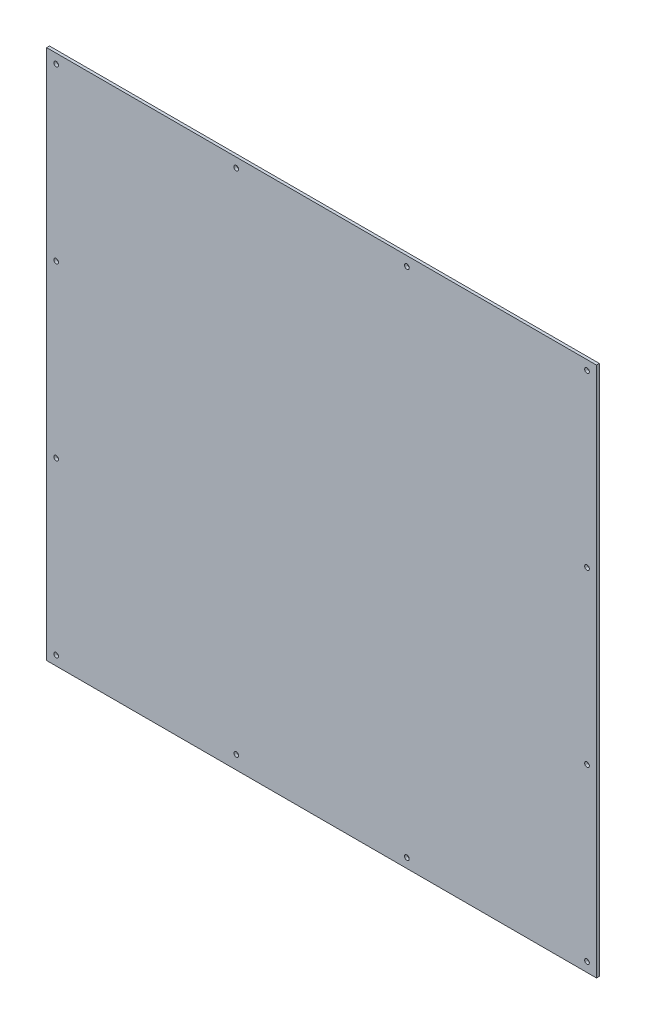
ISO-10303-21;
HEADER;
FILE_DESCRIPTION(('STEP AP214'),'2;1');
FILE_NAME('part.step','',(''),(''),'','','');
FILE_SCHEMA(('AUTOMOTIVE_DESIGN { 1 0 10303 214 1 1 1 1 }'));
ENDSEC;
DATA;
#1=APPLICATION_CONTEXT('core data for automotive mechanical design processes');
#2=APPLICATION_PROTOCOL_DEFINITION('international standard','automotive_design',2000,#1);
#3=PRODUCT_CONTEXT('',#1,'mechanical');
#4=PRODUCT('Part','Part','',(#3));
#5=PRODUCT_RELATED_PRODUCT_CATEGORY('part','',(#4));
#6=PRODUCT_DEFINITION_FORMATION('','',#4);
#7=PRODUCT_DEFINITION_CONTEXT('part definition',#1,'design');
#8=PRODUCT_DEFINITION('design','',#6,#7);
#9=PRODUCT_DEFINITION_SHAPE('','',#8);
#10=(LENGTH_UNIT() NAMED_UNIT(*) SI_UNIT(.MILLI.,.METRE.));
#11=(NAMED_UNIT(*) PLANE_ANGLE_UNIT() SI_UNIT($,.RADIAN.));
#12=(NAMED_UNIT(*) SI_UNIT($,.STERADIAN.) SOLID_ANGLE_UNIT());
#13=UNCERTAINTY_MEASURE_WITH_UNIT(LENGTH_MEASURE(1.E-05),#10,'distance_accuracy_value','');
#14=(GEOMETRIC_REPRESENTATION_CONTEXT(3) GLOBAL_UNCERTAINTY_ASSIGNED_CONTEXT((#13)) GLOBAL_UNIT_ASSIGNED_CONTEXT((#10,
#11,#12)) REPRESENTATION_CONTEXT('',''));
#15=CARTESIAN_POINT('',(0.,0.,0.));
#16=DIRECTION('',(0.,0.,1.));
#17=DIRECTION('',(1.,0.,0.));
#18=AXIS2_PLACEMENT_3D('',#15,#16,#17);
#19=CARTESIAN_POINT('',(-219.558359621451,289.085173501577,3.));
#20=DIRECTION('',(1.,0.,0.));
#21=DIRECTION('',(0.,1.,0.));
#22=AXIS2_PLACEMENT_3D('',#19,#20,#21);
#23=PLANE('',#22);
#24=DIRECTION('',(0.,-1.,0.));
#25=VECTOR('',#24,1.);
#26=CARTESIAN_POINT('',(-219.558359621451,289.085173501577,0.));
#27=LINE('',#26,#25);
#28=CARTESIAN_POINT('',(-219.558359621451,289.085173501577,0.));
#29=VERTEX_POINT('',#28);
#30=CARTESIAN_POINT('',(-219.558359621451,-270.914826498423,0.));
#31=VERTEX_POINT('',#30);
#32=EDGE_CURVE('E96',#29,#31,#27,.T.);
#33=ORIENTED_EDGE('',*,*,#32,.T.);
#34=DIRECTION('',(0.,0.,-1.));
#35=VECTOR('',#34,1.);
#36=CARTESIAN_POINT('',(-219.558359621451,-270.914826498423,3.));
#37=LINE('',#36,#35);
#38=CARTESIAN_POINT('',(-219.558359621451,-270.914826498423,3.));
#39=VERTEX_POINT('',#38);
#40=EDGE_CURVE('E11',#39,#31,#37,.T.);
#41=ORIENTED_EDGE('',*,*,#40,.F.);
#42=DIRECTION('',(0.,-1.,0.));
#43=VECTOR('',#42,1.);
#44=CARTESIAN_POINT('',(-219.558359621451,289.085173501577,3.));
#45=LINE('',#44,#43);
#46=CARTESIAN_POINT('',(-219.558359621451,289.085173501577,3.));
#47=VERTEX_POINT('',#46);
#48=EDGE_CURVE('E84',#47,#39,#45,.T.);
#49=ORIENTED_EDGE('',*,*,#48,.F.);
#50=DIRECTION('',(0.,0.,-1.));
#51=VECTOR('',#50,1.);
#52=CARTESIAN_POINT('',(-219.558359621451,289.085173501577,3.));
#53=LINE('',#52,#51);
#54=EDGE_CURVE('E92',#47,#29,#53,.T.);
#55=ORIENTED_EDGE('',*,*,#54,.T.);
#56=EDGE_LOOP('',(#33,#41,#49,#55));
#57=FACE_BOUND('',#56,.T.);
#58=ADVANCED_FACE('F33',(#57),#23,.F.);
#59=CARTESIAN_POINT('',(-219.558359621451,-270.914826498423,3.));
#60=DIRECTION('',(0.,1.,0.));
#61=DIRECTION('',(0.,0.,1.));
#62=AXIS2_PLACEMENT_3D('',#59,#60,#61);
#63=PLANE('',#62);
#64=DIRECTION('',(1.,0.,0.));
#65=VECTOR('',#64,1.);
#66=CARTESIAN_POINT('',(-219.558359621451,-270.914826498423,0.));
#67=LINE('',#66,#65);
#68=CARTESIAN_POINT('',(360.441640378549,-270.914826498423,0.));
#69=VERTEX_POINT('',#68);
#70=EDGE_CURVE('E88',#31,#69,#67,.T.);
#71=ORIENTED_EDGE('',*,*,#70,.T.);
#72=DIRECTION('',(0.,0.,-1.));
#73=VECTOR('',#72,1.);
#74=CARTESIAN_POINT('',(360.441640378549,-270.914826498423,3.));
#75=LINE('',#74,#73);
#76=CARTESIAN_POINT('',(360.441640378549,-270.914826498423,3.));
#77=VERTEX_POINT('',#76);
#78=EDGE_CURVE('E41',#77,#69,#75,.T.);
#79=ORIENTED_EDGE('',*,*,#78,.F.);
#80=DIRECTION('',(1.,0.,0.));
#81=VECTOR('',#80,1.);
#82=CARTESIAN_POINT('',(-219.558359621451,-270.914826498423,3.));
#83=LINE('',#82,#81);
#84=EDGE_CURVE('E79',#39,#77,#83,.T.);
#85=ORIENTED_EDGE('',*,*,#84,.F.);
#86=ORIENTED_EDGE('',*,*,#40,.T.);
#87=EDGE_LOOP('',(#71,#79,#85,#86));
#88=FACE_BOUND('',#87,.T.);
#89=ADVANCED_FACE('F87',(#88),#63,.F.);
#90=CARTESIAN_POINT('',(360.441640378549,289.085173501577,3.));
#91=DIRECTION('',(-1.,0.,0.));
#92=DIRECTION('',(0.,-1.,0.));
#93=AXIS2_PLACEMENT_3D('',#90,#91,#92);
#94=PLANE('',#93);
#95=DIRECTION('',(0.,1.,0.));
#96=VECTOR('',#95,1.);
#97=CARTESIAN_POINT('',(360.441640378549,289.085173501577,0.));
#98=LINE('',#97,#96);
#99=CARTESIAN_POINT('',(360.441640378549,289.085173501577,0.));
#100=VERTEX_POINT('',#99);
#101=EDGE_CURVE('E66',#69,#100,#98,.T.);
#102=ORIENTED_EDGE('',*,*,#101,.T.);
#103=DIRECTION('',(0.,0.,-1.));
#104=VECTOR('',#103,1.);
#105=CARTESIAN_POINT('',(360.441640378549,289.085173501577,3.));
#106=LINE('',#105,#104);
#107=CARTESIAN_POINT('',(360.441640378549,289.085173501577,3.));
#108=VERTEX_POINT('',#107);
#109=EDGE_CURVE('E89',#108,#100,#106,.T.);
#110=ORIENTED_EDGE('',*,*,#109,.F.);
#111=DIRECTION('',(0.,1.,0.));
#112=VECTOR('',#111,1.);
#113=CARTESIAN_POINT('',(360.441640378549,289.085173501577,3.));
#114=LINE('',#113,#112);
#115=EDGE_CURVE('E82',#77,#108,#114,.T.);
#116=ORIENTED_EDGE('',*,*,#115,.F.);
#117=ORIENTED_EDGE('',*,*,#78,.T.);
#118=EDGE_LOOP('',(#102,#110,#116,#117));
#119=FACE_BOUND('',#118,.T.);
#120=ADVANCED_FACE('F90',(#119),#94,.F.);
#121=CARTESIAN_POINT('',(-219.558359621451,289.085173501577,3.));
#122=DIRECTION('',(0.,-1.,0.));
#123=DIRECTION('',(0.,0.,-1.));
#124=AXIS2_PLACEMENT_3D('',#121,#122,#123);
#125=PLANE('',#124);
#126=DIRECTION('',(-1.,0.,0.));
#127=VECTOR('',#126,1.);
#128=CARTESIAN_POINT('',(-219.558359621451,289.085173501577,0.));
#129=LINE('',#128,#127);
#130=EDGE_CURVE('E72',#100,#29,#129,.T.);
#131=ORIENTED_EDGE('',*,*,#130,.T.);
#132=ORIENTED_EDGE('',*,*,#54,.F.);
#133=DIRECTION('',(-1.,0.,0.));
#134=VECTOR('',#133,1.);
#135=CARTESIAN_POINT('',(-219.558359621451,289.085173501577,3.));
#136=LINE('',#135,#134);
#137=EDGE_CURVE('E49',#108,#47,#136,.T.);
#138=ORIENTED_EDGE('',*,*,#137,.F.);
#139=ORIENTED_EDGE('',*,*,#109,.T.);
#140=EDGE_LOOP('',(#131,#132,#138,#139));
#141=FACE_BOUND('',#140,.T.);
#142=ADVANCED_FACE('F104',(#141),#125,.F.);
#143=CARTESIAN_POINT('',(0.,0.,3.));
#144=DIRECTION('',(0.,0.,1.));
#145=DIRECTION('',(1.,0.,0.));
#146=AXIS2_PLACEMENT_3D('',#143,#144,#145);
#147=PLANE('',#146);
#148=CARTESIAN_POINT('',(-19.558359621451,-256.625367838756,3.));
#149=DIRECTION('',(0.,0.,1.));
#150=DIRECTION('',(1.,0.,0.));
#151=AXIS2_PLACEMENT_3D('',#148,#149,#150);
#152=CIRCLE('',#151,2.5);
#153=CARTESIAN_POINT('',(-17.058359621451,-256.625367838756,3.));
#154=VERTEX_POINT('',#153);
#155=EDGE_CURVE('E140',#154,#154,#152,.T.);
#156=ORIENTED_EDGE('',*,*,#155,.F.);
#157=EDGE_LOOP('',(#156));
#158=FACE_BOUND('',#157,.T.);
#159=CARTESIAN_POINT('',(350.441640378549,-260.914826498423,3.));
#160=DIRECTION('',(0.,0.,1.));
#161=DIRECTION('',(1.,0.,0.));
#162=AXIS2_PLACEMENT_3D('',#159,#160,#161);
#163=CIRCLE('',#162,2.49999999999997);
#164=CARTESIAN_POINT('',(352.941640378549,-260.914826498423,3.));
#165=VERTEX_POINT('',#164);
#166=EDGE_CURVE('E147',#165,#165,#163,.T.);
#167=ORIENTED_EDGE('',*,*,#166,.F.);
#168=EDGE_LOOP('',(#167));
#169=FACE_BOUND('',#168,.T.);
#170=CARTESIAN_POINT('',(350.441640378549,-80.9148264984229,3.));
#171=DIRECTION('',(0.,0.,1.));
#172=DIRECTION('',(1.,0.,0.));
#173=AXIS2_PLACEMENT_3D('',#170,#171,#172);
#174=CIRCLE('',#173,2.49999999999997);
#175=CARTESIAN_POINT('',(352.941640378549,-80.9148264984229,3.));
#176=VERTEX_POINT('',#175);
#177=EDGE_CURVE('E153',#176,#176,#174,.T.);
#178=ORIENTED_EDGE('',*,*,#177,.F.);
#179=EDGE_LOOP('',(#178));
#180=FACE_BOUND('',#179,.T.);
#181=CARTESIAN_POINT('',(350.441640378549,99.0851735015771,3.));
#182=DIRECTION('',(0.,0.,1.));
#183=DIRECTION('',(1.,0.,0.));
#184=AXIS2_PLACEMENT_3D('',#181,#182,#183);
#185=CIRCLE('',#184,2.49999999999997);
#186=CARTESIAN_POINT('',(352.941640378549,99.0851735015771,3.));
#187=VERTEX_POINT('',#186);
#188=EDGE_CURVE('E159',#187,#187,#185,.T.);
#189=ORIENTED_EDGE('',*,*,#188,.F.);
#190=EDGE_LOOP('',(#189));
#191=FACE_BOUND('',#190,.T.);
#192=CARTESIAN_POINT('',(-209.558359621451,99.0851735015771,3.));
#193=DIRECTION('',(0.,0.,1.));
#194=DIRECTION('',(1.,0.,0.));
#195=AXIS2_PLACEMENT_3D('',#192,#193,#194);
#196=CIRCLE('',#195,2.5);
#197=CARTESIAN_POINT('',(-207.058359621451,99.0851735015771,3.));
#198=VERTEX_POINT('',#197);
#199=EDGE_CURVE('E123',#198,#198,#196,.T.);
#200=ORIENTED_EDGE('',*,*,#199,.F.);
#201=EDGE_LOOP('',(#200));
#202=FACE_BOUND('',#201,.T.);
#203=CARTESIAN_POINT('',(-209.558359621451,-260.914826498423,3.));
#204=DIRECTION('',(0.,0.,1.));
#205=DIRECTION('',(1.,0.,0.));
#206=AXIS2_PLACEMENT_3D('',#203,#204,#205);
#207=CIRCLE('',#206,2.5);
#208=CARTESIAN_POINT('',(-207.058359621451,-260.914826498423,3.));
#209=VERTEX_POINT('',#208);
#210=EDGE_CURVE('E116',#209,#209,#207,.T.);
#211=ORIENTED_EDGE('',*,*,#210,.F.);
#212=EDGE_LOOP('',(#211));
#213=FACE_BOUND('',#212,.T.);
#214=CARTESIAN_POINT('',(-209.558359621451,-80.9148264984229,3.));
#215=DIRECTION('',(0.,0.,1.));
#216=DIRECTION('',(1.,0.,0.));
#217=AXIS2_PLACEMENT_3D('',#214,#215,#216);
#218=CIRCLE('',#217,2.5);
#219=CARTESIAN_POINT('',(-207.058359621451,-80.9148264984229,3.));
#220=VERTEX_POINT('',#219);
#221=EDGE_CURVE('E135',#220,#220,#218,.T.);
#222=ORIENTED_EDGE('',*,*,#221,.F.);
#223=EDGE_LOOP('',(#222));
#224=FACE_BOUND('',#223,.T.);
#225=CARTESIAN_POINT('',(350.441640378549,279.085173501577,3.));
#226=DIRECTION('',(0.,0.,1.));
#227=DIRECTION('',(1.,0.,0.));
#228=AXIS2_PLACEMENT_3D('',#225,#226,#227);
#229=CIRCLE('',#228,2.49999999999997);
#230=CARTESIAN_POINT('',(352.941640378549,279.085173501577,3.));
#231=VERTEX_POINT('',#230);
#232=EDGE_CURVE('E128',#231,#231,#229,.T.);
#233=ORIENTED_EDGE('',*,*,#232,.F.);
#234=EDGE_LOOP('',(#233));
#235=FACE_BOUND('',#234,.T.);
#236=CARTESIAN_POINT('',(160.441640378549,279.085173501577,3.));
#237=DIRECTION('',(0.,0.,1.));
#238=DIRECTION('',(1.,0.,0.));
#239=AXIS2_PLACEMENT_3D('',#236,#237,#238);
#240=CIRCLE('',#239,2.5);
#241=CARTESIAN_POINT('',(162.941640378549,279.085173501577,3.));
#242=VERTEX_POINT('',#241);
#243=EDGE_CURVE('E176',#242,#242,#240,.T.);
#244=ORIENTED_EDGE('',*,*,#243,.F.);
#245=EDGE_LOOP('',(#244));
#246=FACE_BOUND('',#245,.T.);
#247=CARTESIAN_POINT('',(-19.558359621451,279.085173501577,3.));
#248=DIRECTION('',(0.,0.,1.));
#249=DIRECTION('',(1.,0.,0.));
#250=AXIS2_PLACEMENT_3D('',#247,#248,#249);
#251=CIRCLE('',#250,2.5);
#252=CARTESIAN_POINT('',(-17.058359621451,279.085173501577,3.));
#253=VERTEX_POINT('',#252);
#254=EDGE_CURVE('E164',#253,#253,#251,.T.);
#255=ORIENTED_EDGE('',*,*,#254,.F.);
#256=EDGE_LOOP('',(#255));
#257=FACE_BOUND('',#256,.T.);
#258=CARTESIAN_POINT('',(160.441640378549,-260.914826498423,3.));
#259=DIRECTION('',(0.,0.,1.));
#260=DIRECTION('',(1.,0.,0.));
#261=AXIS2_PLACEMENT_3D('',#258,#259,#260);
#262=CIRCLE('',#261,2.5);
#263=CARTESIAN_POINT('',(162.941640378549,-260.914826498423,3.));
#264=VERTEX_POINT('',#263);
#265=EDGE_CURVE('E171',#264,#264,#262,.T.);
#266=ORIENTED_EDGE('',*,*,#265,.F.);
#267=EDGE_LOOP('',(#266));
#268=FACE_BOUND('',#267,.T.);
#269=CARTESIAN_POINT('',(-209.558359621451,279.085173501577,3.));
#270=DIRECTION('',(0.,0.,1.));
#271=DIRECTION('',(1.,0.,0.));
#272=AXIS2_PLACEMENT_3D('',#269,#270,#271);
#273=CIRCLE('',#272,2.5);
#274=CARTESIAN_POINT('',(-207.058359621451,279.085173501577,3.));
#275=VERTEX_POINT('',#274);
#276=EDGE_CURVE('E110',#275,#275,#273,.T.);
#277=ORIENTED_EDGE('',*,*,#276,.F.);
#278=EDGE_LOOP('',(#277));
#279=FACE_BOUND('',#278,.T.);
#280=ORIENTED_EDGE('',*,*,#48,.T.);
#281=ORIENTED_EDGE('',*,*,#84,.T.);
#282=ORIENTED_EDGE('',*,*,#115,.T.);
#283=ORIENTED_EDGE('',*,*,#137,.T.);
#284=EDGE_LOOP('',(#280,#281,#282,#283));
#285=FACE_BOUND('',#284,.T.);
#286=ADVANCED_FACE('F80',(#158,#169,#180,#191,#202,#213,#224,#235,#246,#257,#268,#279,#285),
#147,.T.);
#287=CARTESIAN_POINT('',(0.,0.,0.));
#288=DIRECTION('',(0.,0.,1.));
#289=DIRECTION('',(1.,0.,0.));
#290=AXIS2_PLACEMENT_3D('',#287,#288,#289);
#291=PLANE('',#290);
#292=CARTESIAN_POINT('',(-19.558359621451,-256.625367838756,0.));
#293=DIRECTION('',(0.,0.,1.));
#294=DIRECTION('',(1.,0.,0.));
#295=AXIS2_PLACEMENT_3D('',#292,#293,#294);
#296=CIRCLE('',#295,2.5);
#297=CARTESIAN_POINT('',(-17.058359621451,-256.625367838756,0.));
#298=VERTEX_POINT('',#297);
#299=EDGE_CURVE('E143',#298,#298,#296,.T.);
#300=ORIENTED_EDGE('',*,*,#299,.T.);
#301=EDGE_LOOP('',(#300));
#302=FACE_BOUND('',#301,.T.);
#303=CARTESIAN_POINT('',(350.441640378549,-260.914826498423,0.));
#304=DIRECTION('',(0.,0.,1.));
#305=DIRECTION('',(1.,0.,0.));
#306=AXIS2_PLACEMENT_3D('',#303,#304,#305);
#307=CIRCLE('',#306,2.49999999999997);
#308=CARTESIAN_POINT('',(352.941640378549,-260.914826498423,0.));
#309=VERTEX_POINT('',#308);
#310=EDGE_CURVE('E150',#309,#309,#307,.T.);
#311=ORIENTED_EDGE('',*,*,#310,.T.);
#312=EDGE_LOOP('',(#311));
#313=FACE_BOUND('',#312,.T.);
#314=CARTESIAN_POINT('',(350.441640378549,-80.9148264984229,0.));
#315=DIRECTION('',(0.,0.,1.));
#316=DIRECTION('',(1.,0.,0.));
#317=AXIS2_PLACEMENT_3D('',#314,#315,#316);
#318=CIRCLE('',#317,2.49999999999997);
#319=CARTESIAN_POINT('',(352.941640378549,-80.9148264984229,0.));
#320=VERTEX_POINT('',#319);
#321=EDGE_CURVE('E156',#320,#320,#318,.T.);
#322=ORIENTED_EDGE('',*,*,#321,.T.);
#323=EDGE_LOOP('',(#322));
#324=FACE_BOUND('',#323,.T.);
#325=CARTESIAN_POINT('',(350.441640378549,99.0851735015771,0.));
#326=DIRECTION('',(0.,0.,1.));
#327=DIRECTION('',(1.,0.,0.));
#328=AXIS2_PLACEMENT_3D('',#325,#326,#327);
#329=CIRCLE('',#328,2.49999999999997);
#330=CARTESIAN_POINT('',(352.941640378549,99.0851735015771,0.));
#331=VERTEX_POINT('',#330);
#332=EDGE_CURVE('E132',#331,#331,#329,.T.);
#333=ORIENTED_EDGE('',*,*,#332,.T.);
#334=EDGE_LOOP('',(#333));
#335=FACE_BOUND('',#334,.T.);
#336=CARTESIAN_POINT('',(-209.558359621451,99.0851735015771,0.));
#337=DIRECTION('',(0.,0.,1.));
#338=DIRECTION('',(1.,0.,0.));
#339=AXIS2_PLACEMENT_3D('',#336,#337,#338);
#340=CIRCLE('',#339,2.5);
#341=CARTESIAN_POINT('',(-207.058359621451,99.0851735015771,0.));
#342=VERTEX_POINT('',#341);
#343=EDGE_CURVE('E113',#342,#342,#340,.T.);
#344=ORIENTED_EDGE('',*,*,#343,.T.);
#345=EDGE_LOOP('',(#344));
#346=FACE_BOUND('',#345,.T.);
#347=CARTESIAN_POINT('',(-209.558359621451,-260.914826498423,0.));
#348=DIRECTION('',(0.,0.,1.));
#349=DIRECTION('',(1.,0.,0.));
#350=AXIS2_PLACEMENT_3D('',#347,#348,#349);
#351=CIRCLE('',#350,2.5);
#352=CARTESIAN_POINT('',(-207.058359621451,-260.914826498423,0.));
#353=VERTEX_POINT('',#352);
#354=EDGE_CURVE('E119',#353,#353,#351,.T.);
#355=ORIENTED_EDGE('',*,*,#354,.T.);
#356=EDGE_LOOP('',(#355));
#357=FACE_BOUND('',#356,.T.);
#358=CARTESIAN_POINT('',(-209.558359621451,-80.9148264984229,0.));
#359=DIRECTION('',(0.,0.,1.));
#360=DIRECTION('',(1.,0.,0.));
#361=AXIS2_PLACEMENT_3D('',#358,#359,#360);
#362=CIRCLE('',#361,2.5);
#363=CARTESIAN_POINT('',(-207.058359621451,-80.9148264984229,0.));
#364=VERTEX_POINT('',#363);
#365=EDGE_CURVE('E120',#364,#364,#362,.T.);
#366=ORIENTED_EDGE('',*,*,#365,.T.);
#367=EDGE_LOOP('',(#366));
#368=FACE_BOUND('',#367,.T.);
#369=CARTESIAN_POINT('',(350.441640378549,279.085173501577,0.));
#370=DIRECTION('',(0.,0.,1.));
#371=DIRECTION('',(1.,0.,0.));
#372=AXIS2_PLACEMENT_3D('',#369,#370,#371);
#373=CIRCLE('',#372,2.49999999999997);
#374=CARTESIAN_POINT('',(352.941640378549,279.085173501577,0.));
#375=VERTEX_POINT('',#374);
#376=EDGE_CURVE('E131',#375,#375,#373,.T.);
#377=ORIENTED_EDGE('',*,*,#376,.T.);
#378=EDGE_LOOP('',(#377));
#379=FACE_BOUND('',#378,.T.);
#380=CARTESIAN_POINT('',(160.441640378549,279.085173501577,0.));
#381=DIRECTION('',(0.,0.,1.));
#382=DIRECTION('',(1.,0.,0.));
#383=AXIS2_PLACEMENT_3D('',#380,#381,#382);
#384=CIRCLE('',#383,2.5);
#385=CARTESIAN_POINT('',(162.941640378549,279.085173501577,0.));
#386=VERTEX_POINT('',#385);
#387=EDGE_CURVE('E168',#386,#386,#384,.T.);
#388=ORIENTED_EDGE('',*,*,#387,.T.);
#389=EDGE_LOOP('',(#388));
#390=FACE_BOUND('',#389,.T.);
#391=CARTESIAN_POINT('',(-19.558359621451,279.085173501577,0.));
#392=DIRECTION('',(0.,0.,1.));
#393=DIRECTION('',(1.,0.,0.));
#394=AXIS2_PLACEMENT_3D('',#391,#392,#393);
#395=CIRCLE('',#394,2.5);
#396=CARTESIAN_POINT('',(-17.058359621451,279.085173501577,0.));
#397=VERTEX_POINT('',#396);
#398=EDGE_CURVE('E167',#397,#397,#395,.T.);
#399=ORIENTED_EDGE('',*,*,#398,.T.);
#400=EDGE_LOOP('',(#399));
#401=FACE_BOUND('',#400,.T.);
#402=CARTESIAN_POINT('',(160.441640378549,-260.914826498423,0.));
#403=DIRECTION('',(0.,0.,1.));
#404=DIRECTION('',(1.,0.,0.));
#405=AXIS2_PLACEMENT_3D('',#402,#403,#404);
#406=CIRCLE('',#405,2.5);
#407=CARTESIAN_POINT('',(162.941640378549,-260.914826498423,0.));
#408=VERTEX_POINT('',#407);
#409=EDGE_CURVE('E144',#408,#408,#406,.T.);
#410=ORIENTED_EDGE('',*,*,#409,.T.);
#411=EDGE_LOOP('',(#410));
#412=FACE_BOUND('',#411,.T.);
#413=CARTESIAN_POINT('',(-209.558359621451,279.085173501577,0.));
#414=DIRECTION('',(0.,0.,1.));
#415=DIRECTION('',(1.,0.,0.));
#416=AXIS2_PLACEMENT_3D('',#413,#414,#415);
#417=CIRCLE('',#416,2.5);
#418=CARTESIAN_POINT('',(-207.058359621451,279.085173501577,0.));
#419=VERTEX_POINT('',#418);
#420=EDGE_CURVE('E99',#419,#419,#417,.T.);
#421=ORIENTED_EDGE('',*,*,#420,.T.);
#422=EDGE_LOOP('',(#421));
#423=FACE_BOUND('',#422,.T.);
#424=ORIENTED_EDGE('',*,*,#32,.F.);
#425=ORIENTED_EDGE('',*,*,#130,.F.);
#426=ORIENTED_EDGE('',*,*,#101,.F.);
#427=ORIENTED_EDGE('',*,*,#70,.F.);
#428=EDGE_LOOP('',(#424,#425,#426,#427));
#429=FACE_BOUND('',#428,.T.);
#430=ADVANCED_FACE('F107',(#302,#313,#324,#335,#346,#357,#368,#379,#390,#401,#412,#423,#429),
#291,.F.);
#431=CARTESIAN_POINT('',(-209.558359621451,279.085173501577,0.));
#432=DIRECTION('',(0.,0.,1.));
#433=DIRECTION('',(1.,0.,0.));
#434=AXIS2_PLACEMENT_3D('',#431,#432,#433);
#435=CYLINDRICAL_SURFACE('',#434,2.5);
#436=ORIENTED_EDGE('',*,*,#420,.F.);
#437=EDGE_LOOP('',(#436));
#438=FACE_BOUND('',#437,.T.);
#439=ORIENTED_EDGE('',*,*,#276,.T.);
#440=EDGE_LOOP('',(#439));
#441=FACE_BOUND('',#440,.T.);
#442=ADVANCED_FACE('F202',(#438,#441),#435,.F.);
#443=CARTESIAN_POINT('',(160.441640378549,-260.914826498423,0.));
#444=DIRECTION('',(0.,0.,1.));
#445=DIRECTION('',(1.,0.,0.));
#446=AXIS2_PLACEMENT_3D('',#443,#444,#445);
#447=CYLINDRICAL_SURFACE('',#446,2.5);
#448=ORIENTED_EDGE('',*,*,#409,.F.);
#449=EDGE_LOOP('',(#448));
#450=FACE_BOUND('',#449,.T.);
#451=ORIENTED_EDGE('',*,*,#265,.T.);
#452=EDGE_LOOP('',(#451));
#453=FACE_BOUND('',#452,.T.);
#454=ADVANCED_FACE('F204',(#450,#453),#447,.F.);
#455=CARTESIAN_POINT('',(-19.558359621451,279.085173501577,0.));
#456=DIRECTION('',(0.,0.,1.));
#457=DIRECTION('',(1.,0.,0.));
#458=AXIS2_PLACEMENT_3D('',#455,#456,#457);
#459=CYLINDRICAL_SURFACE('',#458,2.5);
#460=ORIENTED_EDGE('',*,*,#398,.F.);
#461=EDGE_LOOP('',(#460));
#462=FACE_BOUND('',#461,.T.);
#463=ORIENTED_EDGE('',*,*,#254,.T.);
#464=EDGE_LOOP('',(#463));
#465=FACE_BOUND('',#464,.T.);
#466=ADVANCED_FACE('F188',(#462,#465),#459,.F.);
#467=CARTESIAN_POINT('',(160.441640378549,279.085173501577,0.));
#468=DIRECTION('',(0.,0.,1.));
#469=DIRECTION('',(1.,0.,0.));
#470=AXIS2_PLACEMENT_3D('',#467,#468,#469);
#471=CYLINDRICAL_SURFACE('',#470,2.5);
#472=ORIENTED_EDGE('',*,*,#387,.F.);
#473=EDGE_LOOP('',(#472));
#474=FACE_BOUND('',#473,.T.);
#475=ORIENTED_EDGE('',*,*,#243,.T.);
#476=EDGE_LOOP('',(#475));
#477=FACE_BOUND('',#476,.T.);
#478=ADVANCED_FACE('F184',(#474,#477),#471,.F.);
#479=CARTESIAN_POINT('',(350.441640378549,279.085173501577,0.));
#480=DIRECTION('',(0.,0.,1.));
#481=DIRECTION('',(1.,0.,0.));
#482=AXIS2_PLACEMENT_3D('',#479,#480,#481);
#483=CYLINDRICAL_SURFACE('',#482,2.49999999999997);
#484=ORIENTED_EDGE('',*,*,#376,.F.);
#485=EDGE_LOOP('',(#484));
#486=FACE_BOUND('',#485,.T.);
#487=ORIENTED_EDGE('',*,*,#232,.T.);
#488=EDGE_LOOP('',(#487));
#489=FACE_BOUND('',#488,.T.);
#490=ADVANCED_FACE('F187',(#486,#489),#483,.F.);
#491=CARTESIAN_POINT('',(-209.558359621451,-80.9148264984229,0.));
#492=DIRECTION('',(0.,0.,1.));
#493=DIRECTION('',(1.,0.,0.));
#494=AXIS2_PLACEMENT_3D('',#491,#492,#493);
#495=CYLINDRICAL_SURFACE('',#494,2.5);
#496=ORIENTED_EDGE('',*,*,#365,.F.);
#497=EDGE_LOOP('',(#496));
#498=FACE_BOUND('',#497,.T.);
#499=ORIENTED_EDGE('',*,*,#221,.T.);
#500=EDGE_LOOP('',(#499));
#501=FACE_BOUND('',#500,.T.);
#502=ADVANCED_FACE('F273',(#498,#501),#495,.F.);
#503=CARTESIAN_POINT('',(-209.558359621451,-260.914826498423,0.));
#504=DIRECTION('',(0.,0.,1.));
#505=DIRECTION('',(1.,0.,0.));
#506=AXIS2_PLACEMENT_3D('',#503,#504,#505);
#507=CYLINDRICAL_SURFACE('',#506,2.5);
#508=ORIENTED_EDGE('',*,*,#354,.F.);
#509=EDGE_LOOP('',(#508));
#510=FACE_BOUND('',#509,.T.);
#511=ORIENTED_EDGE('',*,*,#210,.T.);
#512=EDGE_LOOP('',(#511));
#513=FACE_BOUND('',#512,.T.);
#514=ADVANCED_FACE('F283',(#510,#513),#507,.F.);
#515=CARTESIAN_POINT('',(-209.558359621451,99.0851735015771,0.));
#516=DIRECTION('',(0.,0.,1.));
#517=DIRECTION('',(1.,0.,0.));
#518=AXIS2_PLACEMENT_3D('',#515,#516,#517);
#519=CYLINDRICAL_SURFACE('',#518,2.5);
#520=ORIENTED_EDGE('',*,*,#343,.F.);
#521=EDGE_LOOP('',(#520));
#522=FACE_BOUND('',#521,.T.);
#523=ORIENTED_EDGE('',*,*,#199,.T.);
#524=EDGE_LOOP('',(#523));
#525=FACE_BOUND('',#524,.T.);
#526=ADVANCED_FACE('F293',(#522,#525),#519,.F.);
#527=CARTESIAN_POINT('',(350.441640378549,99.0851735015771,0.));
#528=DIRECTION('',(0.,0.,1.));
#529=DIRECTION('',(1.,0.,0.));
#530=AXIS2_PLACEMENT_3D('',#527,#528,#529);
#531=CYLINDRICAL_SURFACE('',#530,2.49999999999997);
#532=ORIENTED_EDGE('',*,*,#332,.F.);
#533=EDGE_LOOP('',(#532));
#534=FACE_BOUND('',#533,.T.);
#535=ORIENTED_EDGE('',*,*,#188,.T.);
#536=EDGE_LOOP('',(#535));
#537=FACE_BOUND('',#536,.T.);
#538=ADVANCED_FACE('F302',(#534,#537),#531,.F.);
#539=CARTESIAN_POINT('',(350.441640378549,-80.9148264984229,0.));
#540=DIRECTION('',(0.,0.,1.));
#541=DIRECTION('',(1.,0.,0.));
#542=AXIS2_PLACEMENT_3D('',#539,#540,#541);
#543=CYLINDRICAL_SURFACE('',#542,2.49999999999997);
#544=ORIENTED_EDGE('',*,*,#321,.F.);
#545=EDGE_LOOP('',(#544));
#546=FACE_BOUND('',#545,.T.);
#547=ORIENTED_EDGE('',*,*,#177,.T.);
#548=EDGE_LOOP('',(#547));
#549=FACE_BOUND('',#548,.T.);
#550=ADVANCED_FACE('F312',(#546,#549),#543,.F.);
#551=CARTESIAN_POINT('',(350.441640378549,-260.914826498423,0.));
#552=DIRECTION('',(0.,0.,1.));
#553=DIRECTION('',(1.,0.,0.));
#554=AXIS2_PLACEMENT_3D('',#551,#552,#553);
#555=CYLINDRICAL_SURFACE('',#554,2.49999999999997);
#556=ORIENTED_EDGE('',*,*,#310,.F.);
#557=EDGE_LOOP('',(#556));
#558=FACE_BOUND('',#557,.T.);
#559=ORIENTED_EDGE('',*,*,#166,.T.);
#560=EDGE_LOOP('',(#559));
#561=FACE_BOUND('',#560,.T.);
#562=ADVANCED_FACE('F322',(#558,#561),#555,.F.);
#563=CARTESIAN_POINT('',(-19.558359621451,-256.625367838756,0.));
#564=DIRECTION('',(0.,0.,1.));
#565=DIRECTION('',(1.,0.,0.));
#566=AXIS2_PLACEMENT_3D('',#563,#564,#565);
#567=CYLINDRICAL_SURFACE('',#566,2.5);
#568=ORIENTED_EDGE('',*,*,#299,.F.);
#569=EDGE_LOOP('',(#568));
#570=FACE_BOUND('',#569,.T.);
#571=ORIENTED_EDGE('',*,*,#155,.T.);
#572=EDGE_LOOP('',(#571));
#573=FACE_BOUND('',#572,.T.);
#574=ADVANCED_FACE('F332',(#570,#573),#567,.F.);
#575=CLOSED_SHELL('',(#58,#89,#120,#142,#286,#430,#442,#454,#466,#478,#490,#502,#514,#526,#538,
#550,#562,#574));
#576=MANIFOLD_SOLID_BREP('B2',#575);
#577=ADVANCED_BREP_SHAPE_REPRESENTATION('',(#18,#576),#14);
#578=SHAPE_DEFINITION_REPRESENTATION(#9,#577);
ENDSEC;
END-ISO-10303-21;
